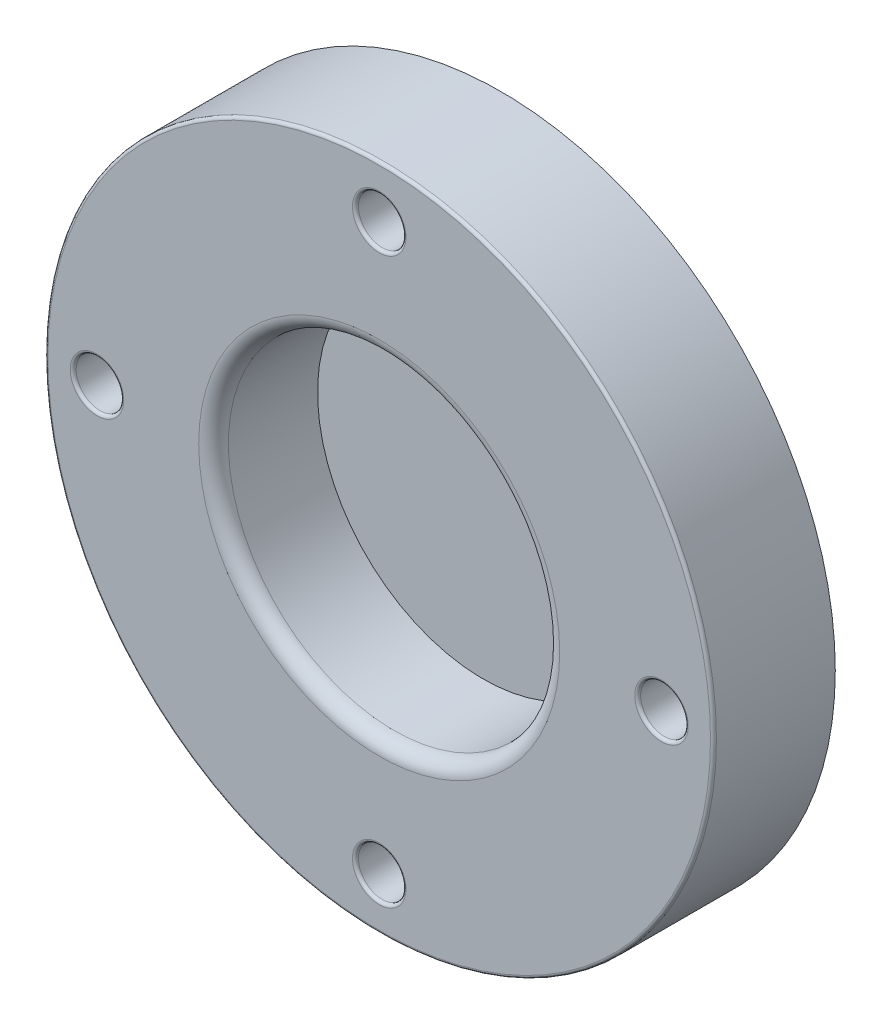
ISO-10303-21;
HEADER;
FILE_DESCRIPTION(('STEP AP214'),'2;1');
FILE_NAME('part.step','',(''),(''),'','','');
FILE_SCHEMA(('AUTOMOTIVE_DESIGN { 1 0 10303 214 1 1 1 1 }'));
ENDSEC;
DATA;
#1=APPLICATION_CONTEXT('core data for automotive mechanical design processes');
#2=APPLICATION_PROTOCOL_DEFINITION('international standard','automotive_design',2000,#1);
#3=PRODUCT_CONTEXT('',#1,'mechanical');
#4=PRODUCT('Part','Part','',(#3));
#5=PRODUCT_RELATED_PRODUCT_CATEGORY('part','',(#4));
#6=PRODUCT_DEFINITION_FORMATION('','',#4);
#7=PRODUCT_DEFINITION_CONTEXT('part definition',#1,'design');
#8=PRODUCT_DEFINITION('design','',#6,#7);
#9=PRODUCT_DEFINITION_SHAPE('','',#8);
#10=(LENGTH_UNIT() NAMED_UNIT(*) SI_UNIT(.MILLI.,.METRE.));
#11=(NAMED_UNIT(*) PLANE_ANGLE_UNIT() SI_UNIT($,.RADIAN.));
#12=(NAMED_UNIT(*) SI_UNIT($,.STERADIAN.) SOLID_ANGLE_UNIT());
#13=UNCERTAINTY_MEASURE_WITH_UNIT(LENGTH_MEASURE(1.E-05),#10,'distance_accuracy_value','');
#14=(GEOMETRIC_REPRESENTATION_CONTEXT(3) GLOBAL_UNCERTAINTY_ASSIGNED_CONTEXT((#13)) GLOBAL_UNIT_ASSIGNED_CONTEXT((#10,
#11,#12)) REPRESENTATION_CONTEXT('',''));
#15=CARTESIAN_POINT('',(0.,0.,0.));
#16=DIRECTION('',(0.,0.,1.));
#17=DIRECTION('',(1.,0.,0.));
#18=AXIS2_PLACEMENT_3D('',#15,#16,#17);
#19=CARTESIAN_POINT('',(0.,0.,8.2));
#20=DIRECTION('',(0.,0.,-1.));
#21=DIRECTION('',(-1.,0.,0.));
#22=AXIS2_PLACEMENT_3D('',#19,#20,#21);
#23=CYLINDRICAL_SURFACE('',#22,22.5);
#24=CARTESIAN_POINT('',(0.,0.,8.));
#25=DIRECTION('',(0.,0.,1.));
#26=DIRECTION('',(1.,0.,0.));
#27=AXIS2_PLACEMENT_3D('',#24,#25,#26);
#28=CIRCLE('',#27,22.5);
#29=CARTESIAN_POINT('',(22.5,0.,8.));
#30=VERTEX_POINT('',#29);
#31=EDGE_CURVE('E10',#30,#30,#28,.F.);
#32=ORIENTED_EDGE('',*,*,#31,.T.);
#33=EDGE_LOOP('',(#32));
#34=FACE_BOUND('',#33,.T.);
#35=CARTESIAN_POINT('',(0.,0.,0.));
#36=DIRECTION('',(0.,0.,1.));
#37=DIRECTION('',(1.,0.,0.));
#38=AXIS2_PLACEMENT_3D('',#35,#36,#37);
#39=CIRCLE('',#38,22.5);
#40=CARTESIAN_POINT('',(22.5,0.,0.));
#41=VERTEX_POINT('',#40);
#42=EDGE_CURVE('E78',#41,#41,#39,.T.);
#43=ORIENTED_EDGE('',*,*,#42,.T.);
#44=EDGE_LOOP('',(#43));
#45=FACE_BOUND('',#44,.T.);
#46=ADVANCED_FACE('F34',(#34,#45),#23,.T.);
#47=CARTESIAN_POINT('',(0.,0.,8.2));
#48=DIRECTION('',(0.,0.,1.));
#49=DIRECTION('',(1.,0.,0.));
#50=AXIS2_PLACEMENT_3D('',#47,#48,#49);
#51=PLANE('',#50);
#52=CARTESIAN_POINT('',(-19.,0.,8.2));
#53=DIRECTION('',(0.,0.,1.));
#54=DIRECTION('',(1.,0.,0.));
#55=AXIS2_PLACEMENT_3D('',#52,#53,#54);
#56=CIRCLE('',#55,1.8);
#57=CARTESIAN_POINT('',(-17.2,0.,8.2));
#58=VERTEX_POINT('',#57);
#59=EDGE_CURVE('E54',#58,#58,#56,.F.);
#60=ORIENTED_EDGE('',*,*,#59,.T.);
#61=EDGE_LOOP('',(#60));
#62=FACE_BOUND('',#61,.T.);
#63=CARTESIAN_POINT('',(0.,19.,8.2));
#64=DIRECTION('',(0.,0.,1.));
#65=DIRECTION('',(1.,0.,0.));
#66=AXIS2_PLACEMENT_3D('',#63,#64,#65);
#67=CIRCLE('',#66,1.8);
#68=CARTESIAN_POINT('',(1.8,19.,8.2));
#69=VERTEX_POINT('',#68);
#70=EDGE_CURVE('E57',#69,#69,#67,.F.);
#71=ORIENTED_EDGE('',*,*,#70,.T.);
#72=EDGE_LOOP('',(#71));
#73=FACE_BOUND('',#72,.T.);
#74=CARTESIAN_POINT('',(19.,0.,8.2));
#75=DIRECTION('',(0.,0.,1.));
#76=DIRECTION('',(1.,0.,0.));
#77=AXIS2_PLACEMENT_3D('',#74,#75,#76);
#78=CIRCLE('',#77,1.8);
#79=CARTESIAN_POINT('',(20.8,0.,8.2));
#80=VERTEX_POINT('',#79);
#81=EDGE_CURVE('E60',#80,#80,#78,.F.);
#82=ORIENTED_EDGE('',*,*,#81,.T.);
#83=EDGE_LOOP('',(#82));
#84=FACE_BOUND('',#83,.T.);
#85=CARTESIAN_POINT('',(0.,-19.,8.2));
#86=DIRECTION('',(0.,0.,1.));
#87=DIRECTION('',(1.,0.,0.));
#88=AXIS2_PLACEMENT_3D('',#85,#86,#87);
#89=CIRCLE('',#88,1.8);
#90=CARTESIAN_POINT('',(1.8,-19.,8.2));
#91=VERTEX_POINT('',#90);
#92=EDGE_CURVE('E63',#91,#91,#89,.F.);
#93=ORIENTED_EDGE('',*,*,#92,.T.);
#94=EDGE_LOOP('',(#93));
#95=FACE_BOUND('',#94,.T.);
#96=CARTESIAN_POINT('',(0.,0.,8.2));
#97=DIRECTION('',(0.,0.,1.));
#98=DIRECTION('',(1.,0.,0.));
#99=AXIS2_PLACEMENT_3D('',#96,#97,#98);
#100=CIRCLE('',#99,22.3);
#101=CARTESIAN_POINT('',(22.3,0.,8.2));
#102=VERTEX_POINT('',#101);
#103=EDGE_CURVE('E66',#102,#102,#100,.T.);
#104=ORIENTED_EDGE('',*,*,#103,.T.);
#105=EDGE_LOOP('',(#104));
#106=FACE_BOUND('',#105,.T.);
#107=CARTESIAN_POINT('',(0.,0.,8.2));
#108=DIRECTION('',(0.,0.,1.));
#109=DIRECTION('',(1.,0.,0.));
#110=AXIS2_PLACEMENT_3D('',#107,#108,#109);
#111=CIRCLE('',#110,12.15);
#112=CARTESIAN_POINT('',(12.15,0.,8.2));
#113=VERTEX_POINT('',#112);
#114=EDGE_CURVE('E72',#113,#113,#111,.F.);
#115=ORIENTED_EDGE('',*,*,#114,.T.);
#116=EDGE_LOOP('',(#115));
#117=FACE_BOUND('',#116,.T.);
#118=ADVANCED_FACE('F117',(#62,#73,#84,#95,#106,#117),#51,.T.);
#119=CARTESIAN_POINT('',(0.,0.,0.));
#120=DIRECTION('',(0.,0.,1.));
#121=DIRECTION('',(1.,0.,0.));
#122=AXIS2_PLACEMENT_3D('',#119,#120,#121);
#123=PLANE('',#122);
#124=CARTESIAN_POINT('',(0.,-19.,0.));
#125=DIRECTION('',(0.,0.,1.));
#126=DIRECTION('',(1.,0.,0.));
#127=AXIS2_PLACEMENT_3D('',#124,#125,#126);
#128=CIRCLE('',#127,1.6);
#129=CARTESIAN_POINT('',(1.6,-19.,0.));
#130=VERTEX_POINT('',#129);
#131=EDGE_CURVE('E93',#130,#130,#128,.T.);
#132=ORIENTED_EDGE('',*,*,#131,.T.);
#133=EDGE_LOOP('',(#132));
#134=FACE_BOUND('',#133,.T.);
#135=CARTESIAN_POINT('',(19.,0.,0.));
#136=DIRECTION('',(0.,0.,1.));
#137=DIRECTION('',(1.,0.,0.));
#138=AXIS2_PLACEMENT_3D('',#135,#136,#137);
#139=CIRCLE('',#138,1.6);
#140=CARTESIAN_POINT('',(20.6,0.,0.));
#141=VERTEX_POINT('',#140);
#142=EDGE_CURVE('E90',#141,#141,#139,.T.);
#143=ORIENTED_EDGE('',*,*,#142,.T.);
#144=EDGE_LOOP('',(#143));
#145=FACE_BOUND('',#144,.T.);
#146=CARTESIAN_POINT('',(0.,19.,0.));
#147=DIRECTION('',(0.,0.,1.));
#148=DIRECTION('',(1.,0.,0.));
#149=AXIS2_PLACEMENT_3D('',#146,#147,#148);
#150=CIRCLE('',#149,1.6);
#151=CARTESIAN_POINT('',(1.6,19.,0.));
#152=VERTEX_POINT('',#151);
#153=EDGE_CURVE('E87',#152,#152,#150,.T.);
#154=ORIENTED_EDGE('',*,*,#153,.T.);
#155=EDGE_LOOP('',(#154));
#156=FACE_BOUND('',#155,.T.);
#157=CARTESIAN_POINT('',(-19.,0.,0.));
#158=DIRECTION('',(0.,0.,1.));
#159=DIRECTION('',(1.,0.,0.));
#160=AXIS2_PLACEMENT_3D('',#157,#158,#159);
#161=CIRCLE('',#160,1.6);
#162=CARTESIAN_POINT('',(-17.4,0.,0.));
#163=VERTEX_POINT('',#162);
#164=EDGE_CURVE('E84',#163,#163,#161,.T.);
#165=ORIENTED_EDGE('',*,*,#164,.T.);
#166=EDGE_LOOP('',(#165));
#167=FACE_BOUND('',#166,.T.);
#168=ORIENTED_EDGE('',*,*,#42,.F.);
#169=EDGE_LOOP('',(#168));
#170=FACE_BOUND('',#169,.T.);
#171=ADVANCED_FACE('F97',(#134,#145,#156,#167,#170),#123,.F.);
#172=CARTESIAN_POINT('',(0.,0.,1.2));
#173=DIRECTION('',(0.,0.,1.));
#174=DIRECTION('',(1.,0.,0.));
#175=AXIS2_PLACEMENT_3D('',#172,#173,#174);
#176=CYLINDRICAL_SURFACE('',#175,11.15);
#177=CARTESIAN_POINT('',(0.,0.,7.2));
#178=DIRECTION('',(0.,0.,1.));
#179=DIRECTION('',(1.,0.,0.));
#180=AXIS2_PLACEMENT_3D('',#177,#178,#179);
#181=CIRCLE('',#180,11.15);
#182=CARTESIAN_POINT('',(11.15,0.,7.2));
#183=VERTEX_POINT('',#182);
#184=EDGE_CURVE('E75',#183,#183,#181,.T.);
#185=ORIENTED_EDGE('',*,*,#184,.T.);
#186=EDGE_LOOP('',(#185));
#187=FACE_BOUND('',#186,.T.);
#188=CARTESIAN_POINT('',(0.,0.,1.2));
#189=DIRECTION('',(0.,0.,1.));
#190=DIRECTION('',(1.,0.,0.));
#191=AXIS2_PLACEMENT_3D('',#188,#189,#190);
#192=CIRCLE('',#191,11.15);
#193=CARTESIAN_POINT('',(11.15,0.,1.2));
#194=VERTEX_POINT('',#193);
#195=EDGE_CURVE('E81',#194,#194,#192,.T.);
#196=ORIENTED_EDGE('',*,*,#195,.F.);
#197=EDGE_LOOP('',(#196));
#198=FACE_BOUND('',#197,.T.);
#199=ADVANCED_FACE('F155',(#187,#198),#176,.F.);
#200=CARTESIAN_POINT('',(0.,0.,1.2));
#201=DIRECTION('',(0.,0.,1.));
#202=DIRECTION('',(1.,0.,0.));
#203=AXIS2_PLACEMENT_3D('',#200,#201,#202);
#204=PLANE('',#203);
#205=ORIENTED_EDGE('',*,*,#195,.T.);
#206=EDGE_LOOP('',(#205));
#207=FACE_BOUND('',#206,.T.);
#208=ADVANCED_FACE('F158',(#207),#204,.T.);
#209=CARTESIAN_POINT('',(-19.,0.,0.));
#210=DIRECTION('',(0.,0.,1.));
#211=DIRECTION('',(1.,0.,0.));
#212=AXIS2_PLACEMENT_3D('',#209,#210,#211);
#213=CYLINDRICAL_SURFACE('',#212,1.6);
#214=CARTESIAN_POINT('',(-19.,0.,8.));
#215=DIRECTION('',(0.,0.,1.));
#216=DIRECTION('',(1.,0.,0.));
#217=AXIS2_PLACEMENT_3D('',#214,#215,#216);
#218=CIRCLE('',#217,1.6);
#219=CARTESIAN_POINT('',(-17.4,0.,8.));
#220=VERTEX_POINT('',#219);
#221=EDGE_CURVE('E69',#220,#220,#218,.T.);
#222=ORIENTED_EDGE('',*,*,#221,.T.);
#223=EDGE_LOOP('',(#222));
#224=FACE_BOUND('',#223,.T.);
#225=ORIENTED_EDGE('',*,*,#164,.F.);
#226=EDGE_LOOP('',(#225));
#227=FACE_BOUND('',#226,.T.);
#228=ADVANCED_FACE('F163',(#224,#227),#213,.F.);
#229=CARTESIAN_POINT('',(0.,19.,0.));
#230=DIRECTION('',(0.,0.,1.));
#231=DIRECTION('',(1.,0.,0.));
#232=AXIS2_PLACEMENT_3D('',#229,#230,#231);
#233=CYLINDRICAL_SURFACE('',#232,1.6);
#234=CARTESIAN_POINT('',(0.,19.,8.));
#235=DIRECTION('',(0.,0.,1.));
#236=DIRECTION('',(1.,0.,0.));
#237=AXIS2_PLACEMENT_3D('',#234,#235,#236);
#238=CIRCLE('',#237,1.6);
#239=CARTESIAN_POINT('',(1.6,19.,8.));
#240=VERTEX_POINT('',#239);
#241=EDGE_CURVE('E49',#240,#240,#238,.T.);
#242=ORIENTED_EDGE('',*,*,#241,.T.);
#243=EDGE_LOOP('',(#242));
#244=FACE_BOUND('',#243,.T.);
#245=ORIENTED_EDGE('',*,*,#153,.F.);
#246=EDGE_LOOP('',(#245));
#247=FACE_BOUND('',#246,.T.);
#248=ADVANCED_FACE('F113',(#244,#247),#233,.F.);
#249=CARTESIAN_POINT('',(19.,0.,0.));
#250=DIRECTION('',(0.,0.,1.));
#251=DIRECTION('',(1.,0.,0.));
#252=AXIS2_PLACEMENT_3D('',#249,#250,#251);
#253=CYLINDRICAL_SURFACE('',#252,1.6);
#254=CARTESIAN_POINT('',(19.,0.,8.));
#255=DIRECTION('',(0.,0.,1.));
#256=DIRECTION('',(1.,0.,0.));
#257=AXIS2_PLACEMENT_3D('',#254,#255,#256);
#258=CIRCLE('',#257,1.6);
#259=CARTESIAN_POINT('',(20.6,0.,8.));
#260=VERTEX_POINT('',#259);
#261=EDGE_CURVE('E45',#260,#260,#258,.T.);
#262=ORIENTED_EDGE('',*,*,#261,.T.);
#263=EDGE_LOOP('',(#262));
#264=FACE_BOUND('',#263,.T.);
#265=ORIENTED_EDGE('',*,*,#142,.F.);
#266=EDGE_LOOP('',(#265));
#267=FACE_BOUND('',#266,.T.);
#268=ADVANCED_FACE('F103',(#264,#267),#253,.F.);
#269=CARTESIAN_POINT('',(0.,-19.,0.));
#270=DIRECTION('',(0.,0.,1.));
#271=DIRECTION('',(1.,0.,0.));
#272=AXIS2_PLACEMENT_3D('',#269,#270,#271);
#273=CYLINDRICAL_SURFACE('',#272,1.6);
#274=CARTESIAN_POINT('',(0.,-19.,8.));
#275=DIRECTION('',(0.,0.,1.));
#276=DIRECTION('',(1.,0.,0.));
#277=AXIS2_PLACEMENT_3D('',#274,#275,#276);
#278=CIRCLE('',#277,1.6);
#279=CARTESIAN_POINT('',(1.6,-19.,8.));
#280=VERTEX_POINT('',#279);
#281=EDGE_CURVE('E41',#280,#280,#278,.T.);
#282=ORIENTED_EDGE('',*,*,#281,.T.);
#283=EDGE_LOOP('',(#282));
#284=FACE_BOUND('',#283,.T.);
#285=ORIENTED_EDGE('',*,*,#131,.F.);
#286=EDGE_LOOP('',(#285));
#287=FACE_BOUND('',#286,.T.);
#288=ADVANCED_FACE('F100',(#284,#287),#273,.F.);
#289=CARTESIAN_POINT('',(0.,0.,7.2));
#290=DIRECTION('',(0.,0.,1.));
#291=DIRECTION('',(1.,0.,0.));
#292=AXIS2_PLACEMENT_3D('',#289,#290,#291);
#293=TOROIDAL_SURFACE('',#292,12.15,1.);
#294=ORIENTED_EDGE('',*,*,#114,.F.);
#295=EDGE_LOOP('',(#294));
#296=FACE_BOUND('',#295,.T.);
#297=ORIENTED_EDGE('',*,*,#184,.F.);
#298=EDGE_LOOP('',(#297));
#299=FACE_BOUND('',#298,.T.);
#300=ADVANCED_FACE('F102',(#296,#299),#293,.T.);
#301=CARTESIAN_POINT('',(-19.,0.,8.));
#302=DIRECTION('',(0.,0.,1.));
#303=DIRECTION('',(1.,0.,0.));
#304=AXIS2_PLACEMENT_3D('',#301,#302,#303);
#305=TOROIDAL_SURFACE('',#304,1.8,0.2);
#306=ORIENTED_EDGE('',*,*,#59,.F.);
#307=EDGE_LOOP('',(#306));
#308=FACE_BOUND('',#307,.T.);
#309=ORIENTED_EDGE('',*,*,#221,.F.);
#310=EDGE_LOOP('',(#309));
#311=FACE_BOUND('',#310,.T.);
#312=ADVANCED_FACE('F110',(#308,#311),#305,.T.);
#313=CARTESIAN_POINT('',(0.,19.,8.));
#314=DIRECTION('',(0.,0.,1.));
#315=DIRECTION('',(1.,0.,0.));
#316=AXIS2_PLACEMENT_3D('',#313,#314,#315);
#317=TOROIDAL_SURFACE('',#316,1.8,0.2);
#318=ORIENTED_EDGE('',*,*,#70,.F.);
#319=EDGE_LOOP('',(#318));
#320=FACE_BOUND('',#319,.T.);
#321=ORIENTED_EDGE('',*,*,#241,.F.);
#322=EDGE_LOOP('',(#321));
#323=FACE_BOUND('',#322,.T.);
#324=ADVANCED_FACE('F130',(#320,#323),#317,.T.);
#325=CARTESIAN_POINT('',(19.,0.,8.));
#326=DIRECTION('',(0.,0.,1.));
#327=DIRECTION('',(1.,0.,0.));
#328=AXIS2_PLACEMENT_3D('',#325,#326,#327);
#329=TOROIDAL_SURFACE('',#328,1.8,0.2);
#330=ORIENTED_EDGE('',*,*,#81,.F.);
#331=EDGE_LOOP('',(#330));
#332=FACE_BOUND('',#331,.T.);
#333=ORIENTED_EDGE('',*,*,#261,.F.);
#334=EDGE_LOOP('',(#333));
#335=FACE_BOUND('',#334,.T.);
#336=ADVANCED_FACE('F134',(#332,#335),#329,.T.);
#337=CARTESIAN_POINT('',(0.,-19.,8.));
#338=DIRECTION('',(0.,0.,1.));
#339=DIRECTION('',(1.,0.,0.));
#340=AXIS2_PLACEMENT_3D('',#337,#338,#339);
#341=TOROIDAL_SURFACE('',#340,1.8,0.2);
#342=ORIENTED_EDGE('',*,*,#92,.F.);
#343=EDGE_LOOP('',(#342));
#344=FACE_BOUND('',#343,.T.);
#345=ORIENTED_EDGE('',*,*,#281,.F.);
#346=EDGE_LOOP('',(#345));
#347=FACE_BOUND('',#346,.T.);
#348=ADVANCED_FACE('F137',(#344,#347),#341,.T.);
#349=CARTESIAN_POINT('',(0.,0.,8.));
#350=DIRECTION('',(0.,0.,1.));
#351=DIRECTION('',(1.,0.,0.));
#352=AXIS2_PLACEMENT_3D('',#349,#350,#351);
#353=TOROIDAL_SURFACE('',#352,22.3,0.2);
#354=ORIENTED_EDGE('',*,*,#31,.F.);
#355=EDGE_LOOP('',(#354));
#356=FACE_BOUND('',#355,.T.);
#357=ORIENTED_EDGE('',*,*,#103,.F.);
#358=EDGE_LOOP('',(#357));
#359=FACE_BOUND('',#358,.T.);
#360=ADVANCED_FACE('F36',(#356,#359),#353,.T.);
#361=CLOSED_SHELL('',(#46,#118,#171,#199,#208,#228,#248,#268,#288,#300,#312,#324,#336,#348,#360));
#362=MANIFOLD_SOLID_BREP('B2',#361);
#363=ADVANCED_BREP_SHAPE_REPRESENTATION('',(#18,#362),#14);
#364=SHAPE_DEFINITION_REPRESENTATION(#9,#363);
ENDSEC;
END-ISO-10303-21;
